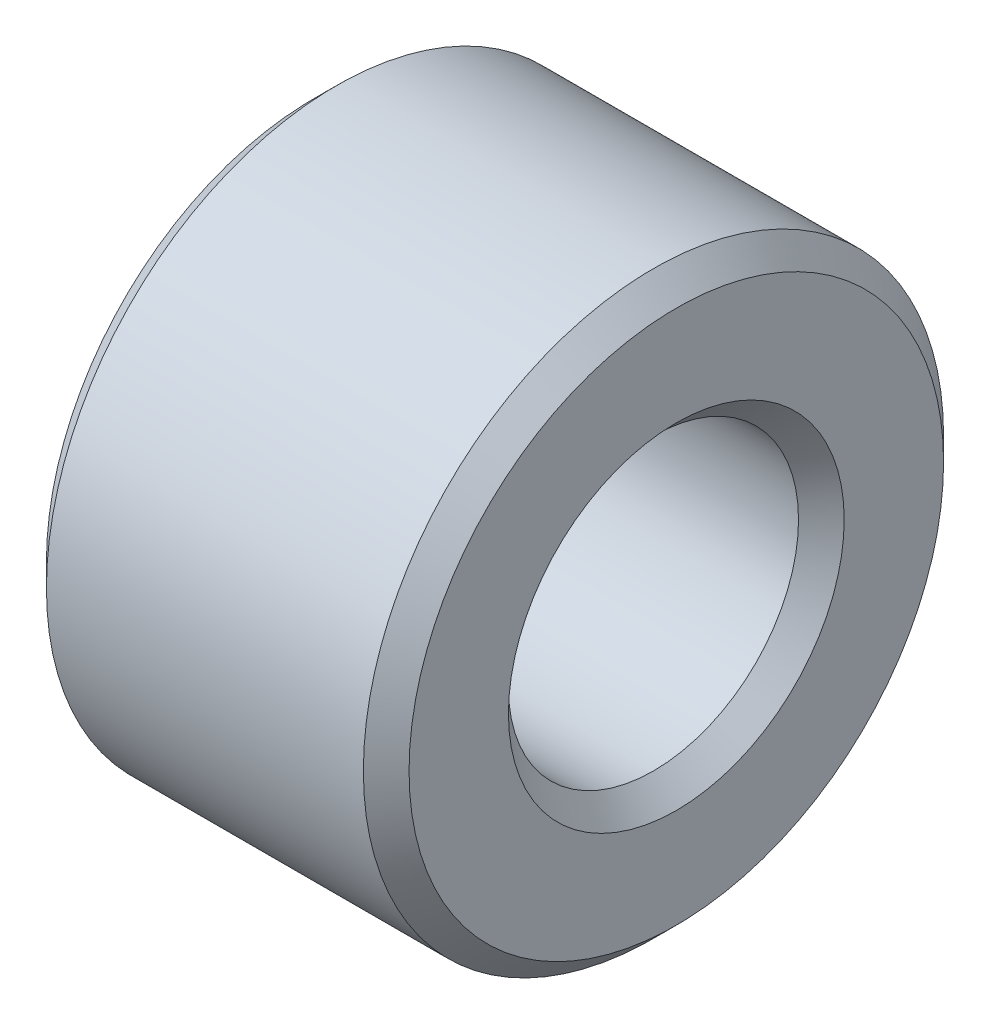
ISO-10303-21;
HEADER;
FILE_DESCRIPTION(('STEP AP214'),'2;1');
FILE_NAME('part.step','',(''),(''),'','','');
FILE_SCHEMA(('AUTOMOTIVE_DESIGN { 1 0 10303 214 1 1 1 1 }'));
ENDSEC;
DATA;
#1=APPLICATION_CONTEXT('core data for automotive mechanical design processes');
#2=APPLICATION_PROTOCOL_DEFINITION('international standard','automotive_design',2000,#1);
#3=PRODUCT_CONTEXT('',#1,'mechanical');
#4=PRODUCT('Part','Part','',(#3));
#5=PRODUCT_RELATED_PRODUCT_CATEGORY('part','',(#4));
#6=PRODUCT_DEFINITION_FORMATION('','',#4);
#7=PRODUCT_DEFINITION_CONTEXT('part definition',#1,'design');
#8=PRODUCT_DEFINITION('design','',#6,#7);
#9=PRODUCT_DEFINITION_SHAPE('','',#8);
#10=(LENGTH_UNIT() NAMED_UNIT(*) SI_UNIT(.MILLI.,.METRE.));
#11=(NAMED_UNIT(*) PLANE_ANGLE_UNIT() SI_UNIT($,.RADIAN.));
#12=(NAMED_UNIT(*) SI_UNIT($,.STERADIAN.) SOLID_ANGLE_UNIT());
#13=UNCERTAINTY_MEASURE_WITH_UNIT(LENGTH_MEASURE(1.E-05),#10,'distance_accuracy_value','');
#14=(GEOMETRIC_REPRESENTATION_CONTEXT(3) GLOBAL_UNCERTAINTY_ASSIGNED_CONTEXT((#13)) GLOBAL_UNIT_ASSIGNED_CONTEXT((#10,
#11,#12)) REPRESENTATION_CONTEXT('',''));
#15=CARTESIAN_POINT('',(0.,0.,0.));
#16=DIRECTION('',(0.,0.,1.));
#17=DIRECTION('',(1.,0.,0.));
#18=AXIS2_PLACEMENT_3D('',#15,#16,#17);
#19=CARTESIAN_POINT('',(31.75,0.,0.));
#20=DIRECTION('',(1.,0.,0.));
#21=DIRECTION('',(0.,0.,-1.));
#22=AXIS2_PLACEMENT_3D('',#19,#20,#21);
#23=PLANE('',#22);
#24=CARTESIAN_POINT('',(31.75,0.,0.));
#25=DIRECTION('',(1.,0.,0.));
#26=DIRECTION('',(0.,0.,-1.));
#27=AXIS2_PLACEMENT_3D('',#24,#25,#26);
#28=CIRCLE('',#27,23.4);
#29=CARTESIAN_POINT('',(31.75,0.,-23.4));
#30=VERTEX_POINT('',#29);
#31=EDGE_CURVE('E55',#30,#30,#28,.T.);
#32=ORIENTED_EDGE('',*,*,#31,.T.);
#33=EDGE_LOOP('',(#32));
#34=FACE_BOUND('',#33,.T.);
#35=CARTESIAN_POINT('',(31.75,0.,0.));
#36=DIRECTION('',(1.,0.,0.));
#37=DIRECTION('',(0.,0.,-1.));
#38=AXIS2_PLACEMENT_3D('',#35,#36,#37);
#39=CIRCLE('',#38,14.7);
#40=CARTESIAN_POINT('',(31.75,0.,-14.7));
#41=VERTEX_POINT('',#40);
#42=EDGE_CURVE('E60',#41,#41,#39,.F.);
#43=ORIENTED_EDGE('',*,*,#42,.T.);
#44=EDGE_LOOP('',(#43));
#45=FACE_BOUND('',#44,.T.);
#46=ADVANCED_FACE('F41',(#34,#45),#23,.T.);
#47=CARTESIAN_POINT('',(0.,0.,0.));
#48=DIRECTION('',(1.,0.,0.));
#49=DIRECTION('',(0.,0.,-1.));
#50=AXIS2_PLACEMENT_3D('',#47,#48,#49);
#51=PLANE('',#50);
#52=CARTESIAN_POINT('',(0.,0.,0.));
#53=DIRECTION('',(1.,0.,0.));
#54=DIRECTION('',(0.,0.,-1.));
#55=AXIS2_PLACEMENT_3D('',#52,#53,#54);
#56=CIRCLE('',#55,23.4);
#57=CARTESIAN_POINT('',(0.,0.,-23.4));
#58=VERTEX_POINT('',#57);
#59=EDGE_CURVE('E66',#58,#58,#56,.F.);
#60=ORIENTED_EDGE('',*,*,#59,.T.);
#61=EDGE_LOOP('',(#60));
#62=FACE_BOUND('',#61,.T.);
#63=CARTESIAN_POINT('',(0.,0.,0.));
#64=DIRECTION('',(1.,0.,0.));
#65=DIRECTION('',(0.,0.,-1.));
#66=AXIS2_PLACEMENT_3D('',#63,#64,#65);
#67=CIRCLE('',#66,14.7);
#68=CARTESIAN_POINT('',(0.,0.,-14.7));
#69=VERTEX_POINT('',#68);
#70=EDGE_CURVE('E70',#69,#69,#67,.T.);
#71=ORIENTED_EDGE('',*,*,#70,.T.);
#72=EDGE_LOOP('',(#71));
#73=FACE_BOUND('',#72,.T.);
#74=ADVANCED_FACE('F95',(#62,#73),#51,.F.);
#75=CARTESIAN_POINT('',(31.75,0.,0.));
#76=DIRECTION('',(-1.,0.,0.));
#77=DIRECTION('',(0.,0.,1.));
#78=AXIS2_PLACEMENT_3D('',#75,#76,#77);
#79=CYLINDRICAL_SURFACE('',#78,25.4);
#80=CARTESIAN_POINT('',(1.99999999999999,0.,0.));
#81=DIRECTION('',(1.,0.,0.));
#82=DIRECTION('',(0.,0.,-1.));
#83=AXIS2_PLACEMENT_3D('',#80,#81,#82);
#84=CIRCLE('',#83,25.4);
#85=CARTESIAN_POINT('',(1.99999999999999,0.,-25.4));
#86=VERTEX_POINT('',#85);
#87=EDGE_CURVE('E74',#86,#86,#84,.T.);
#88=ORIENTED_EDGE('',*,*,#87,.T.);
#89=EDGE_LOOP('',(#88));
#90=FACE_BOUND('',#89,.T.);
#91=CARTESIAN_POINT('',(29.75,0.,0.));
#92=DIRECTION('',(1.,0.,0.));
#93=DIRECTION('',(0.,0.,-1.));
#94=AXIS2_PLACEMENT_3D('',#91,#92,#93);
#95=CIRCLE('',#94,25.4);
#96=CARTESIAN_POINT('',(29.75,0.,-25.4));
#97=VERTEX_POINT('',#96);
#98=EDGE_CURVE('E78',#97,#97,#95,.F.);
#99=ORIENTED_EDGE('',*,*,#98,.T.);
#100=EDGE_LOOP('',(#99));
#101=FACE_BOUND('',#100,.T.);
#102=ADVANCED_FACE('F83',(#90,#101),#79,.T.);
#103=CARTESIAN_POINT('',(31.75,0.,0.));
#104=DIRECTION('',(-1.,0.,0.));
#105=DIRECTION('',(0.,0.,1.));
#106=AXIS2_PLACEMENT_3D('',#103,#104,#105);
#107=CYLINDRICAL_SURFACE('',#106,12.7);
#108=CARTESIAN_POINT('',(2.00000000000001,0.,0.));
#109=DIRECTION('',(1.,0.,0.));
#110=DIRECTION('',(0.,0.,-1.));
#111=AXIS2_PLACEMENT_3D('',#108,#109,#110);
#112=CIRCLE('',#111,12.7);
#113=CARTESIAN_POINT('',(2.00000000000001,0.,-12.7));
#114=VERTEX_POINT('',#113);
#115=EDGE_CURVE('E10',#114,#114,#112,.F.);
#116=ORIENTED_EDGE('',*,*,#115,.T.);
#117=EDGE_LOOP('',(#116));
#118=FACE_BOUND('',#117,.T.);
#119=CARTESIAN_POINT('',(29.75,0.,0.));
#120=DIRECTION('',(1.,0.,0.));
#121=DIRECTION('',(0.,0.,-1.));
#122=AXIS2_PLACEMENT_3D('',#119,#120,#121);
#123=CIRCLE('',#122,12.7);
#124=CARTESIAN_POINT('',(29.75,0.,-12.7));
#125=VERTEX_POINT('',#124);
#126=EDGE_CURVE('E50',#125,#125,#123,.T.);
#127=ORIENTED_EDGE('',*,*,#126,.T.);
#128=EDGE_LOOP('',(#127));
#129=FACE_BOUND('',#128,.T.);
#130=ADVANCED_FACE('F120',(#118,#129),#107,.F.);
#131=CARTESIAN_POINT('',(1.99999999999999,0.,0.));
#132=DIRECTION('',(1.,0.,0.));
#133=DIRECTION('',(0.,0.,-1.));
#134=AXIS2_PLACEMENT_3D('',#131,#132,#133);
#135=CONICAL_SURFACE('',#134,25.4,0.785398163397451);
#136=ORIENTED_EDGE('',*,*,#59,.F.);
#137=EDGE_LOOP('',(#136));
#138=FACE_BOUND('',#137,.T.);
#139=ORIENTED_EDGE('',*,*,#87,.F.);
#140=EDGE_LOOP('',(#139));
#141=FACE_BOUND('',#140,.T.);
#142=ADVANCED_FACE('F89',(#138,#141),#135,.T.);
#143=CARTESIAN_POINT('',(31.75,0.,0.));
#144=DIRECTION('',(-1.,0.,0.));
#145=DIRECTION('',(0.,0.,1.));
#146=AXIS2_PLACEMENT_3D('',#143,#144,#145);
#147=CONICAL_SURFACE('',#146,23.4,0.785398163397447);
#148=ORIENTED_EDGE('',*,*,#98,.F.);
#149=EDGE_LOOP('',(#148));
#150=FACE_BOUND('',#149,.T.);
#151=ORIENTED_EDGE('',*,*,#31,.F.);
#152=EDGE_LOOP('',(#151));
#153=FACE_BOUND('',#152,.T.);
#154=ADVANCED_FACE('F85',(#150,#153),#147,.T.);
#155=CARTESIAN_POINT('',(0.,0.,0.));
#156=DIRECTION('',(-1.,0.,0.));
#157=DIRECTION('',(0.,0.,1.));
#158=AXIS2_PLACEMENT_3D('',#155,#156,#157);
#159=CONICAL_SURFACE('',#158,14.7,0.785398163397449);
#160=ORIENTED_EDGE('',*,*,#115,.F.);
#161=EDGE_LOOP('',(#160));
#162=FACE_BOUND('',#161,.T.);
#163=ORIENTED_EDGE('',*,*,#70,.F.);
#164=EDGE_LOOP('',(#163));
#165=FACE_BOUND('',#164,.T.);
#166=ADVANCED_FACE('F88',(#162,#165),#159,.F.);
#167=CARTESIAN_POINT('',(29.75,0.,0.));
#168=DIRECTION('',(1.,0.,0.));
#169=DIRECTION('',(0.,0.,-1.));
#170=AXIS2_PLACEMENT_3D('',#167,#168,#169);
#171=CONICAL_SURFACE('',#170,12.7,0.78539816339745);
#172=ORIENTED_EDGE('',*,*,#42,.F.);
#173=EDGE_LOOP('',(#172));
#174=FACE_BOUND('',#173,.T.);
#175=ORIENTED_EDGE('',*,*,#126,.F.);
#176=EDGE_LOOP('',(#175));
#177=FACE_BOUND('',#176,.T.);
#178=ADVANCED_FACE('F44',(#174,#177),#171,.F.);
#179=CLOSED_SHELL('',(#46,#74,#102,#130,#142,#154,#166,#178));
#180=MANIFOLD_SOLID_BREP('B2',#179);
#181=ADVANCED_BREP_SHAPE_REPRESENTATION('',(#18,#180),#14);
#182=SHAPE_DEFINITION_REPRESENTATION(#9,#181);
ENDSEC;
END-ISO-10303-21;
